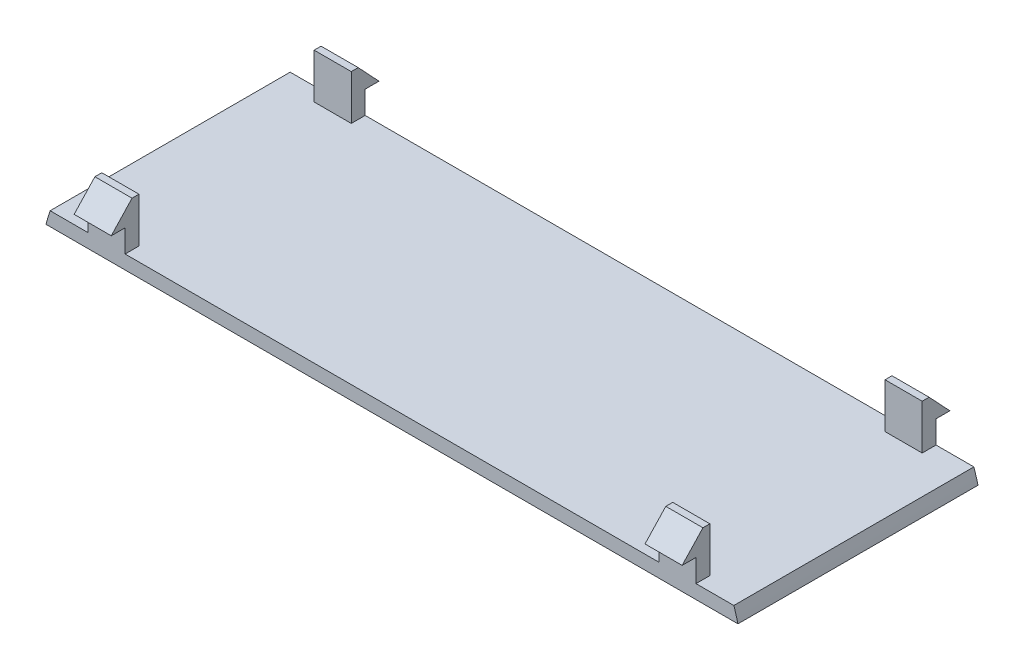
ISO-10303-21;
HEADER;
FILE_DESCRIPTION(('STEP AP214'),'2;1');
FILE_NAME('part.step','',(''),(''),'','','');
FILE_SCHEMA(('AUTOMOTIVE_DESIGN { 1 0 10303 214 1 1 1 1 }'));
ENDSEC;
DATA;
#1=APPLICATION_CONTEXT('core data for automotive mechanical design processes');
#2=APPLICATION_PROTOCOL_DEFINITION('international standard','automotive_design',2000,#1);
#3=PRODUCT_CONTEXT('',#1,'mechanical');
#4=PRODUCT('Part','Part','',(#3));
#5=PRODUCT_RELATED_PRODUCT_CATEGORY('part','',(#4));
#6=PRODUCT_DEFINITION_FORMATION('','',#4);
#7=PRODUCT_DEFINITION_CONTEXT('part definition',#1,'design');
#8=PRODUCT_DEFINITION('design','',#6,#7);
#9=PRODUCT_DEFINITION_SHAPE('','',#8);
#10=(LENGTH_UNIT() NAMED_UNIT(*) SI_UNIT(.MILLI.,.METRE.));
#11=(NAMED_UNIT(*) PLANE_ANGLE_UNIT() SI_UNIT($,.RADIAN.));
#12=(NAMED_UNIT(*) SI_UNIT($,.STERADIAN.) SOLID_ANGLE_UNIT());
#13=UNCERTAINTY_MEASURE_WITH_UNIT(LENGTH_MEASURE(1.E-05),#10,'distance_accuracy_value','');
#14=(GEOMETRIC_REPRESENTATION_CONTEXT(3) GLOBAL_UNCERTAINTY_ASSIGNED_CONTEXT((#13)) GLOBAL_UNIT_ASSIGNED_CONTEXT((#10,
#11,#12)) REPRESENTATION_CONTEXT('',''));
#15=CARTESIAN_POINT('',(0.,0.,0.));
#16=DIRECTION('',(0.,0.,1.));
#17=DIRECTION('',(1.,0.,0.));
#18=AXIS2_PLACEMENT_3D('',#15,#16,#17);
#19=CARTESIAN_POINT('',(-78.8038191019252,1.5875,27.5));
#20=DIRECTION('',(0.,-1.,0.));
#21=DIRECTION('',(0.,0.,-1.));
#22=AXIS2_PLACEMENT_3D('',#19,#20,#21);
#23=PLANE('',#22);
#24=DIRECTION('',(-1.,0.,0.));
#25=VECTOR('',#24,1.);
#26=CARTESIAN_POINT('',(-70.2133803974664,1.5875,1.587500136));
#27=LINE('',#26,#25);
#28=CARTESIAN_POINT('',(-70.2133803974664,1.5875,1.587500136));
#29=VERTEX_POINT('',#28);
#30=CARTESIAN_POINT('',(-74.4678803974664,1.5875,1.587500136));
#31=VERTEX_POINT('',#30);
#32=EDGE_CURVE('E59',#29,#31,#27,.T.);
#33=ORIENTED_EDGE('',*,*,#32,.T.);
#34=DIRECTION('',(0.,0.,-1.));
#35=VECTOR('',#34,1.);
#36=CARTESIAN_POINT('',(-74.4678803974664,1.5875,1.587500136));
#37=LINE('',#36,#35);
#38=CARTESIAN_POINT('',(-74.4678803974664,1.5875,1.36000006395465E-07));
#39=VERTEX_POINT('',#38);
#40=EDGE_CURVE('E721',#31,#39,#37,.T.);
#41=ORIENTED_EDGE('',*,*,#40,.T.);
#42=DIRECTION('',(-1.,0.,0.));
#43=VECTOR('',#42,1.);
#44=CARTESIAN_POINT('',(-78.8038191019252,1.5875,0.));
#45=LINE('',#44,#43);
#46=CARTESIAN_POINT('',(-78.8038191019252,1.5875,0.));
#47=VERTEX_POINT('',#46);
#48=EDGE_CURVE('E41',#39,#47,#45,.T.);
#49=ORIENTED_EDGE('',*,*,#48,.T.);
#50=DIRECTION('',(0.,0.,-1.));
#51=VECTOR('',#50,1.);
#52=CARTESIAN_POINT('',(-78.8038191019252,1.5875,27.5));
#53=LINE('',#52,#51);
#54=CARTESIAN_POINT('',(-78.8038191019252,1.5875,27.5));
#55=VERTEX_POINT('',#54);
#56=EDGE_CURVE('E47',#55,#47,#53,.T.);
#57=ORIENTED_EDGE('',*,*,#56,.F.);
#58=DIRECTION('',(-1.,0.,0.));
#59=VECTOR('',#58,1.);
#60=CARTESIAN_POINT('',(-78.8038191019252,1.5875,27.5));
#61=LINE('',#60,#59);
#62=CARTESIAN_POINT('',(-74.4678803974664,1.5875,27.5));
#63=VERTEX_POINT('',#62);
#64=EDGE_CURVE('E527',#63,#55,#61,.T.);
#65=ORIENTED_EDGE('',*,*,#64,.F.);
#66=DIRECTION('',(0.,0.,1.));
#67=VECTOR('',#66,1.);
#68=CARTESIAN_POINT('',(-74.4678803974664,1.5875,25.9125));
#69=LINE('',#68,#67);
#70=CARTESIAN_POINT('',(-74.4678803974664,1.5875,25.9125));
#71=VERTEX_POINT('',#70);
#72=EDGE_CURVE('E381',#71,#63,#69,.T.);
#73=ORIENTED_EDGE('',*,*,#72,.F.);
#74=DIRECTION('',(-1.,0.,0.));
#75=VECTOR('',#74,1.);
#76=CARTESIAN_POINT('',(-70.2133803974664,1.5875,25.9125));
#77=LINE('',#76,#75);
#78=CARTESIAN_POINT('',(-70.2133803974664,1.5875,25.9125));
#79=VERTEX_POINT('',#78);
#80=EDGE_CURVE('E365',#79,#71,#77,.T.);
#81=ORIENTED_EDGE('',*,*,#80,.F.);
#82=DIRECTION('',(0.,0.,1.));
#83=VECTOR('',#82,1.);
#84=CARTESIAN_POINT('',(-70.2133803974664,1.5875,25.9125));
#85=LINE('',#84,#83);
#86=CARTESIAN_POINT('',(-70.2133803974664,1.5875,27.5));
#87=VERTEX_POINT('',#86);
#88=EDGE_CURVE('E377',#79,#87,#85,.T.);
#89=ORIENTED_EDGE('',*,*,#88,.T.);
#90=CARTESIAN_POINT('',(-9.06288039746642,1.5875,27.5));
#91=VERTEX_POINT('',#90);
#92=EDGE_CURVE('E536',#91,#87,#61,.T.);
#93=ORIENTED_EDGE('',*,*,#92,.F.);
#94=DIRECTION('',(0.,0.,1.));
#95=VECTOR('',#94,1.);
#96=CARTESIAN_POINT('',(-9.06288039746642,1.5875,25.9125));
#97=LINE('',#96,#95);
#98=CARTESIAN_POINT('',(-9.06288039746642,1.5875,25.9125));
#99=VERTEX_POINT('',#98);
#100=EDGE_CURVE('E461',#99,#91,#97,.T.);
#101=ORIENTED_EDGE('',*,*,#100,.F.);
#102=DIRECTION('',(-1.,0.,0.));
#103=VECTOR('',#102,1.);
#104=CARTESIAN_POINT('',(-4.80838039746641,1.5875,25.9125));
#105=LINE('',#104,#103);
#106=CARTESIAN_POINT('',(-4.80838039746641,1.5875,25.9125));
#107=VERTEX_POINT('',#106);
#108=EDGE_CURVE('E445',#107,#99,#105,.T.);
#109=ORIENTED_EDGE('',*,*,#108,.F.);
#110=DIRECTION('',(0.,0.,1.));
#111=VECTOR('',#110,1.);
#112=CARTESIAN_POINT('',(-4.80838039746641,1.5875,25.9125));
#113=LINE('',#112,#111);
#114=CARTESIAN_POINT('',(-4.80838039746642,1.5875,27.5));
#115=VERTEX_POINT('',#114);
#116=EDGE_CURVE('E457',#107,#115,#113,.T.);
#117=ORIENTED_EDGE('',*,*,#116,.T.);
#118=CARTESIAN_POINT('',(-0.472441693007641,1.5875,27.5));
#119=VERTEX_POINT('',#118);
#120=EDGE_CURVE('E539',#119,#115,#61,.T.);
#121=ORIENTED_EDGE('',*,*,#120,.F.);
#122=DIRECTION('',(0.,0.,-1.));
#123=VECTOR('',#122,1.);
#124=CARTESIAN_POINT('',(-0.472441693007641,1.5875,27.5));
#125=LINE('',#124,#123);
#126=CARTESIAN_POINT('',(-0.472441693007641,1.5875,0.));
#127=VERTEX_POINT('',#126);
#128=EDGE_CURVE('E12',#119,#127,#125,.T.);
#129=ORIENTED_EDGE('',*,*,#128,.T.);
#130=CARTESIAN_POINT('',(-4.80838039746642,1.5875,0.));
#131=VERTEX_POINT('',#130);
#132=EDGE_CURVE('E553',#127,#131,#45,.T.);
#133=ORIENTED_EDGE('',*,*,#132,.T.);
#134=DIRECTION('',(0.,0.,-1.));
#135=VECTOR('',#134,1.);
#136=CARTESIAN_POINT('',(-4.80838039746641,1.5875,1.587500136));
#137=LINE('',#136,#135);
#138=CARTESIAN_POINT('',(-4.80838039746642,1.5875,1.587500136));
#139=VERTEX_POINT('',#138);
#140=EDGE_CURVE('E295',#139,#131,#137,.T.);
#141=ORIENTED_EDGE('',*,*,#140,.F.);
#142=DIRECTION('',(-1.,0.,0.));
#143=VECTOR('',#142,1.);
#144=CARTESIAN_POINT('',(-4.80838039746641,1.5875,1.587500136));
#145=LINE('',#144,#143);
#146=CARTESIAN_POINT('',(-9.06288039746642,1.5875,1.587500136));
#147=VERTEX_POINT('',#146);
#148=EDGE_CURVE('E284',#139,#147,#145,.T.);
#149=ORIENTED_EDGE('',*,*,#148,.T.);
#150=DIRECTION('',(0.,0.,-1.));
#151=VECTOR('',#150,1.);
#152=CARTESIAN_POINT('',(-9.06288039746642,1.5875,1.587500136));
#153=LINE('',#152,#151);
#154=CARTESIAN_POINT('',(-9.06288039746642,1.5875,1.36000006395465E-07));
#155=VERTEX_POINT('',#154);
#156=EDGE_CURVE('E286',#147,#155,#153,.T.);
#157=ORIENTED_EDGE('',*,*,#156,.T.);
#158=CARTESIAN_POINT('',(-70.2133803974664,1.5875,0.));
#159=VERTEX_POINT('',#158);
#160=EDGE_CURVE('E558',#155,#159,#45,.T.);
#161=ORIENTED_EDGE('',*,*,#160,.T.);
#162=DIRECTION('',(0.,0.,-1.));
#163=VECTOR('',#162,1.);
#164=CARTESIAN_POINT('',(-70.2133803974664,1.5875,1.587500136));
#165=LINE('',#164,#163);
#166=EDGE_CURVE('E55',#29,#159,#165,.T.);
#167=ORIENTED_EDGE('',*,*,#166,.F.);
#168=EDGE_LOOP('',(#33,#41,#49,#57,#65,#73,#81,#89,#93,#101,#109,#117,#121,#129,#133,#141,#149,
#157,#161,#167));
#169=FACE_BOUND('',#168,.T.);
#170=ADVANCED_FACE('F37',(#169),#23,.F.);
#171=CARTESIAN_POINT('',(-23.0456664164429,-5.99436532700956,27.5));
#172=DIRECTION('',(0.,0.,-1.));
#173=DIRECTION('',(-1.,0.,0.));
#174=AXIS2_PLACEMENT_3D('',#171,#172,#173);
#175=CYLINDRICAL_SURFACE('',#174,23.812500000034);
#176=CARTESIAN_POINT('',(-23.0456664164429,-5.99436532700956,0.));
#177=DIRECTION('',(0.,0.,1.));
#178=DIRECTION('',(-1.,0.,0.));
#179=AXIS2_PLACEMENT_3D('',#176,#177,#178);
#180=CIRCLE('',#179,23.812500000034);
#181=CARTESIAN_POINT('',(0.,0.,0.));
#182=VERTEX_POINT('',#181);
#183=EDGE_CURVE('E460',#182,#127,#180,.T.);
#184=ORIENTED_EDGE('',*,*,#183,.T.);
#185=ORIENTED_EDGE('',*,*,#128,.F.);
#186=CARTESIAN_POINT('',(-23.0456664164429,-5.99436532700956,27.5));
#187=DIRECTION('',(0.,0.,1.));
#188=DIRECTION('',(-1.,0.,0.));
#189=AXIS2_PLACEMENT_3D('',#186,#187,#188);
#190=CIRCLE('',#189,23.812500000034);
#191=CARTESIAN_POINT('',(0.,0.,27.5));
#192=VERTEX_POINT('',#191);
#193=EDGE_CURVE('E524',#192,#119,#190,.T.);
#194=ORIENTED_EDGE('',*,*,#193,.F.);
#195=DIRECTION('',(0.,0.,-1.));
#196=VECTOR('',#195,1.);
#197=CARTESIAN_POINT('',(0.,0.,27.5));
#198=LINE('',#197,#196);
#199=EDGE_CURVE('E547',#192,#182,#198,.T.);
#200=ORIENTED_EDGE('',*,*,#199,.T.);
#201=EDGE_LOOP('',(#184,#185,#194,#200));
#202=FACE_BOUND('',#201,.T.);
#203=ADVANCED_FACE('F39',(#202),#175,.T.);
#204=CARTESIAN_POINT('',(-56.2305943782771,-5.99436532707289,27.5));
#205=DIRECTION('',(0.,0.,-1.));
#206=DIRECTION('',(-1.,0.,0.));
#207=AXIS2_PLACEMENT_3D('',#204,#205,#206);
#208=CYLINDRICAL_SURFACE('',#207,23.8125000002559);
#209=CARTESIAN_POINT('',(-56.2305943782771,-5.99436532707289,0.));
#210=DIRECTION('',(0.,0.,1.));
#211=DIRECTION('',(-1.,0.,0.));
#212=AXIS2_PLACEMENT_3D('',#209,#210,#211);
#213=CIRCLE('',#212,23.8125000002559);
#214=CARTESIAN_POINT('',(-79.2762607949328,0.,0.));
#215=VERTEX_POINT('',#214);
#216=EDGE_CURVE('E552',#47,#215,#213,.T.);
#217=ORIENTED_EDGE('',*,*,#216,.T.);
#218=DIRECTION('',(0.,0.,-1.));
#219=VECTOR('',#218,1.);
#220=CARTESIAN_POINT('',(-79.2762607949328,0.,27.5));
#221=LINE('',#220,#219);
#222=CARTESIAN_POINT('',(-79.2762607949328,0.,27.5));
#223=VERTEX_POINT('',#222);
#224=EDGE_CURVE('E544',#223,#215,#221,.T.);
#225=ORIENTED_EDGE('',*,*,#224,.F.);
#226=CARTESIAN_POINT('',(-56.2305943782771,-5.99436532707289,27.5));
#227=DIRECTION('',(0.,0.,1.));
#228=DIRECTION('',(-1.,0.,0.));
#229=AXIS2_PLACEMENT_3D('',#226,#227,#228);
#230=CIRCLE('',#229,23.8125000002559);
#231=EDGE_CURVE('E531',#55,#223,#230,.T.);
#232=ORIENTED_EDGE('',*,*,#231,.F.);
#233=ORIENTED_EDGE('',*,*,#56,.T.);
#234=EDGE_LOOP('',(#217,#225,#232,#233));
#235=FACE_BOUND('',#234,.T.);
#236=ADVANCED_FACE('F595',(#235),#208,.T.);
#237=CARTESIAN_POINT('',(0.,0.,27.5));
#238=DIRECTION('',(0.,1.,0.));
#239=DIRECTION('',(0.,0.,1.));
#240=AXIS2_PLACEMENT_3D('',#237,#238,#239);
#241=PLANE('',#240);
#242=DIRECTION('',(1.,0.,0.));
#243=VECTOR('',#242,1.);
#244=CARTESIAN_POINT('',(0.,0.,0.));
#245=LINE('',#244,#243);
#246=EDGE_CURVE('E528',#215,#182,#245,.T.);
#247=ORIENTED_EDGE('',*,*,#246,.T.);
#248=ORIENTED_EDGE('',*,*,#199,.F.);
#249=DIRECTION('',(1.,0.,0.));
#250=VECTOR('',#249,1.);
#251=CARTESIAN_POINT('',(0.,0.,27.5));
#252=LINE('',#251,#250);
#253=EDGE_CURVE('E550',#223,#192,#252,.T.);
#254=ORIENTED_EDGE('',*,*,#253,.F.);
#255=ORIENTED_EDGE('',*,*,#224,.T.);
#256=EDGE_LOOP('',(#247,#248,#254,#255));
#257=FACE_BOUND('',#256,.T.);
#258=ADVANCED_FACE('F601',(#257),#241,.F.);
#259=CARTESIAN_POINT('',(-23.0456664164429,-5.99436532700956,27.5));
#260=DIRECTION('',(0.,0.,-1.));
#261=DIRECTION('',(-1.,0.,0.));
#262=AXIS2_PLACEMENT_3D('',#259,#260,#261);
#263=PLANE('',#262);
#264=ORIENTED_EDGE('',*,*,#193,.T.);
#265=ORIENTED_EDGE('',*,*,#120,.T.);
#266=DIRECTION('',(0.,1.,0.));
#267=VECTOR('',#266,1.);
#268=CARTESIAN_POINT('',(-4.80838039746641,1.5875,27.5));
#269=LINE('',#268,#267);
#270=CARTESIAN_POINT('',(-4.80838039746641,4.191,27.5));
#271=VERTEX_POINT('',#270);
#272=EDGE_CURVE('E464',#115,#271,#269,.T.);
#273=ORIENTED_EDGE('',*,*,#272,.T.);
#274=DIRECTION('',(-1.,0.,0.));
#275=VECTOR('',#274,1.);
#276=CARTESIAN_POINT('',(-4.80838039746641,4.191,27.5));
#277=LINE('',#276,#275);
#278=CARTESIAN_POINT('',(-9.06288039746642,4.191,27.5));
#279=VERTEX_POINT('',#278);
#280=EDGE_CURVE('E480',#271,#279,#277,.T.);
#281=ORIENTED_EDGE('',*,*,#280,.T.);
#282=DIRECTION('',(0.,1.,0.));
#283=VECTOR('',#282,1.);
#284=CARTESIAN_POINT('',(-9.06288039746642,1.5875,27.5));
#285=LINE('',#284,#283);
#286=EDGE_CURVE('E467',#91,#279,#285,.T.);
#287=ORIENTED_EDGE('',*,*,#286,.F.);
#288=ORIENTED_EDGE('',*,*,#92,.T.);
#289=DIRECTION('',(0.,1.,0.));
#290=VECTOR('',#289,1.);
#291=CARTESIAN_POINT('',(-70.2133803974664,1.5875,27.5));
#292=LINE('',#291,#290);
#293=CARTESIAN_POINT('',(-70.2133803974664,4.191,27.5));
#294=VERTEX_POINT('',#293);
#295=EDGE_CURVE('E384',#87,#294,#292,.T.);
#296=ORIENTED_EDGE('',*,*,#295,.T.);
#297=DIRECTION('',(-1.,0.,0.));
#298=VECTOR('',#297,1.);
#299=CARTESIAN_POINT('',(-70.2133803974664,4.191,27.5));
#300=LINE('',#299,#298);
#301=CARTESIAN_POINT('',(-74.4678803974664,4.191,27.5));
#302=VERTEX_POINT('',#301);
#303=EDGE_CURVE('E401',#294,#302,#300,.T.);
#304=ORIENTED_EDGE('',*,*,#303,.T.);
#305=DIRECTION('',(0.,1.,0.));
#306=VECTOR('',#305,1.);
#307=CARTESIAN_POINT('',(-74.4678803974664,1.5875,27.5));
#308=LINE('',#307,#306);
#309=EDGE_CURVE('E387',#63,#302,#308,.T.);
#310=ORIENTED_EDGE('',*,*,#309,.F.);
#311=ORIENTED_EDGE('',*,*,#64,.T.);
#312=ORIENTED_EDGE('',*,*,#231,.T.);
#313=ORIENTED_EDGE('',*,*,#253,.T.);
#314=EDGE_LOOP('',(#264,#265,#273,#281,#287,#288,#296,#304,#310,#311,#312,#313));
#315=FACE_BOUND('',#314,.T.);
#316=ADVANCED_FACE('F566',(#315),#263,.F.);
#317=CARTESIAN_POINT('',(-23.0456664164429,-5.99436532700956,0.));
#318=DIRECTION('',(0.,0.,-1.));
#319=DIRECTION('',(-1.,0.,0.));
#320=AXIS2_PLACEMENT_3D('',#317,#318,#319);
#321=PLANE('',#320);
#322=ORIENTED_EDGE('',*,*,#183,.F.);
#323=ORIENTED_EDGE('',*,*,#246,.F.);
#324=ORIENTED_EDGE('',*,*,#216,.F.);
#325=ORIENTED_EDGE('',*,*,#48,.F.);
#326=DIRECTION('',(0.,1.,0.));
#327=VECTOR('',#326,1.);
#328=CARTESIAN_POINT('',(-74.4678803974664,1.5875,1.36000006395465E-07));
#329=LINE('',#328,#327);
#330=CARTESIAN_POINT('',(-74.4678803974664,4.191,1.36000006395465E-07));
#331=VERTEX_POINT('',#330);
#332=EDGE_CURVE('E732',#39,#331,#329,.T.);
#333=ORIENTED_EDGE('',*,*,#332,.T.);
#334=DIRECTION('',(-1.,0.,0.));
#335=VECTOR('',#334,1.);
#336=CARTESIAN_POINT('',(-70.2133803974664,4.191,1.36000006395465E-07));
#337=LINE('',#336,#335);
#338=CARTESIAN_POINT('',(-70.2133803974664,4.191,1.36000006395465E-07));
#339=VERTEX_POINT('',#338);
#340=EDGE_CURVE('E276',#339,#331,#337,.T.);
#341=ORIENTED_EDGE('',*,*,#340,.F.);
#342=DIRECTION('',(0.,1.,0.));
#343=VECTOR('',#342,1.);
#344=CARTESIAN_POINT('',(-70.2133803974664,1.5875,1.36000006395465E-07));
#345=LINE('',#344,#343);
#346=EDGE_CURVE('E281',#159,#339,#345,.T.);
#347=ORIENTED_EDGE('',*,*,#346,.F.);
#348=ORIENTED_EDGE('',*,*,#160,.F.);
#349=DIRECTION('',(0.,1.,0.));
#350=VECTOR('',#349,1.);
#351=CARTESIAN_POINT('',(-9.06288039746642,1.5875,1.36000006395465E-07));
#352=LINE('',#351,#350);
#353=CARTESIAN_POINT('',(-9.06288039746642,4.191,1.36000006395465E-07));
#354=VERTEX_POINT('',#353);
#355=EDGE_CURVE('E305',#155,#354,#352,.T.);
#356=ORIENTED_EDGE('',*,*,#355,.T.);
#357=DIRECTION('',(-1.,0.,0.));
#358=VECTOR('',#357,1.);
#359=CARTESIAN_POINT('',(-4.80838039746641,4.191,1.36000006395465E-07));
#360=LINE('',#359,#358);
#361=CARTESIAN_POINT('',(-4.80838039746641,4.191,1.36000006395465E-07));
#362=VERTEX_POINT('',#361);
#363=EDGE_CURVE('E304',#362,#354,#360,.T.);
#364=ORIENTED_EDGE('',*,*,#363,.F.);
#365=DIRECTION('',(0.,1.,0.));
#366=VECTOR('',#365,1.);
#367=CARTESIAN_POINT('',(-4.80838039746641,1.5875,1.36000006395465E-07));
#368=LINE('',#367,#366);
#369=EDGE_CURVE('E301',#131,#362,#368,.T.);
#370=ORIENTED_EDGE('',*,*,#369,.F.);
#371=ORIENTED_EDGE('',*,*,#132,.F.);
#372=EDGE_LOOP('',(#322,#323,#324,#325,#333,#341,#347,#348,#356,#364,#370,#371));
#373=FACE_BOUND('',#372,.T.);
#374=ADVANCED_FACE('F634',(#373),#321,.T.);
#375=CARTESIAN_POINT('',(-9.06288039746641,0.,0.));
#376=DIRECTION('',(-1.,0.,0.));
#377=DIRECTION('',(0.,0.,1.));
#378=AXIS2_PLACEMENT_3D('',#375,#376,#377);
#379=PLANE('',#378);
#380=DIRECTION('',(0.,-1.,0.));
#381=VECTOR('',#380,1.);
#382=CARTESIAN_POINT('',(-9.06288039746642,6.731,25.9125));
#383=LINE('',#382,#381);
#384=CARTESIAN_POINT('',(-9.06288039746642,6.731,25.9125));
#385=VERTEX_POINT('',#384);
#386=EDGE_CURVE('E380',#385,#99,#383,.T.);
#387=ORIENTED_EDGE('',*,*,#386,.T.);
#388=ORIENTED_EDGE('',*,*,#100,.T.);
#389=ORIENTED_EDGE('',*,*,#286,.T.);
#390=DIRECTION('',(0.,0.,1.));
#391=VECTOR('',#390,1.);
#392=CARTESIAN_POINT('',(-9.06288039746642,4.191,27.5));
#393=LINE('',#392,#391);
#394=CARTESIAN_POINT('',(-9.06288039746642,4.191,29.0875));
#395=VERTEX_POINT('',#394);
#396=EDGE_CURVE('E483',#279,#395,#393,.T.);
#397=ORIENTED_EDGE('',*,*,#396,.T.);
#398=DIRECTION('',(0.,0.729537204140085,-0.68394112888133));
#399=VECTOR('',#398,1.);
#400=CARTESIAN_POINT('',(-9.06288039746642,4.191,29.0875));
#401=LINE('',#400,#399);
#402=CARTESIAN_POINT('',(-9.06288039746642,6.731,26.70625));
#403=VERTEX_POINT('',#402);
#404=EDGE_CURVE('E497',#395,#403,#401,.T.);
#405=ORIENTED_EDGE('',*,*,#404,.T.);
#406=DIRECTION('',(0.,0.,-1.));
#407=VECTOR('',#406,1.);
#408=CARTESIAN_POINT('',(-9.06288039746642,6.731,26.70625));
#409=LINE('',#408,#407);
#410=EDGE_CURVE('E448',#403,#385,#409,.T.);
#411=ORIENTED_EDGE('',*,*,#410,.T.);
#412=EDGE_LOOP('',(#387,#388,#389,#397,#405,#411));
#413=FACE_BOUND('',#412,.T.);
#414=ADVANCED_FACE('F616',(#413),#379,.T.);
#415=CARTESIAN_POINT('',(-4.80838039746641,0.,0.));
#416=DIRECTION('',(-1.,0.,0.));
#417=DIRECTION('',(0.,0.,1.));
#418=AXIS2_PLACEMENT_3D('',#415,#416,#417);
#419=PLANE('',#418);
#420=DIRECTION('',(0.,-1.,0.));
#421=VECTOR('',#420,1.);
#422=CARTESIAN_POINT('',(-4.80838039746641,6.731,25.9125));
#423=LINE('',#422,#421);
#424=CARTESIAN_POINT('',(-4.80838039746641,6.731,25.9125));
#425=VERTEX_POINT('',#424);
#426=EDGE_CURVE('E449',#425,#107,#423,.T.);
#427=ORIENTED_EDGE('',*,*,#426,.F.);
#428=DIRECTION('',(0.,0.,-1.));
#429=VECTOR('',#428,1.);
#430=CARTESIAN_POINT('',(-4.80838039746641,6.731,26.70625));
#431=LINE('',#430,#429);
#432=CARTESIAN_POINT('',(-4.80838039746641,6.731,26.70625));
#433=VERTEX_POINT('',#432);
#434=EDGE_CURVE('E505',#433,#425,#431,.T.);
#435=ORIENTED_EDGE('',*,*,#434,.F.);
#436=DIRECTION('',(0.,0.729537204140085,-0.68394112888133));
#437=VECTOR('',#436,1.);
#438=CARTESIAN_POINT('',(-4.80838039746641,4.191,29.0875));
#439=LINE('',#438,#437);
#440=CARTESIAN_POINT('',(-4.80838039746641,4.191,29.0875));
#441=VERTEX_POINT('',#440);
#442=EDGE_CURVE('E491',#441,#433,#439,.T.);
#443=ORIENTED_EDGE('',*,*,#442,.F.);
#444=DIRECTION('',(0.,0.,1.));
#445=VECTOR('',#444,1.);
#446=CARTESIAN_POINT('',(-4.80838039746641,4.191,27.5));
#447=LINE('',#446,#445);
#448=EDGE_CURVE('E477',#271,#441,#447,.T.);
#449=ORIENTED_EDGE('',*,*,#448,.F.);
#450=ORIENTED_EDGE('',*,*,#272,.F.);
#451=ORIENTED_EDGE('',*,*,#116,.F.);
#452=EDGE_LOOP('',(#427,#435,#443,#449,#450,#451));
#453=FACE_BOUND('',#452,.T.);
#454=ADVANCED_FACE('F610',(#453),#419,.F.);
#455=CARTESIAN_POINT('',(-4.80838039746641,6.731,25.9125));
#456=DIRECTION('',(0.,0.,-1.));
#457=DIRECTION('',(-1.,0.,0.));
#458=AXIS2_PLACEMENT_3D('',#455,#456,#457);
#459=PLANE('',#458);
#460=ORIENTED_EDGE('',*,*,#386,.F.);
#461=DIRECTION('',(-1.,0.,0.));
#462=VECTOR('',#461,1.);
#463=CARTESIAN_POINT('',(-4.80838039746641,6.731,25.9125));
#464=LINE('',#463,#462);
#465=EDGE_CURVE('E454',#425,#385,#464,.T.);
#466=ORIENTED_EDGE('',*,*,#465,.F.);
#467=ORIENTED_EDGE('',*,*,#426,.T.);
#468=ORIENTED_EDGE('',*,*,#108,.T.);
#469=EDGE_LOOP('',(#460,#466,#467,#468));
#470=FACE_BOUND('',#469,.T.);
#471=ADVANCED_FACE('F621',(#470),#459,.T.);
#472=CARTESIAN_POINT('',(-4.80838039746641,6.731,26.70625));
#473=DIRECTION('',(0.,1.,0.));
#474=DIRECTION('',(-1.,0.,0.));
#475=AXIS2_PLACEMENT_3D('',#472,#473,#474);
#476=PLANE('',#475);
#477=ORIENTED_EDGE('',*,*,#410,.F.);
#478=DIRECTION('',(-1.,0.,0.));
#479=VECTOR('',#478,1.);
#480=CARTESIAN_POINT('',(-4.80838039746641,6.731,26.70625));
#481=LINE('',#480,#479);
#482=EDGE_CURVE('E508',#433,#403,#481,.T.);
#483=ORIENTED_EDGE('',*,*,#482,.F.);
#484=ORIENTED_EDGE('',*,*,#434,.T.);
#485=ORIENTED_EDGE('',*,*,#465,.T.);
#486=EDGE_LOOP('',(#477,#483,#484,#485));
#487=FACE_BOUND('',#486,.T.);
#488=ADVANCED_FACE('F624',(#487),#476,.T.);
#489=CARTESIAN_POINT('',(-4.80838039746641,4.191,29.0875));
#490=DIRECTION('',(0.,0.68394112888133,0.729537204140085));
#491=DIRECTION('',(0.,-0.729537204140085,0.68394112888133));
#492=AXIS2_PLACEMENT_3D('',#489,#490,#491);
#493=PLANE('',#492);
#494=ORIENTED_EDGE('',*,*,#404,.F.);
#495=DIRECTION('',(-1.,0.,0.));
#496=VECTOR('',#495,1.);
#497=CARTESIAN_POINT('',(-4.80838039746641,4.191,29.0875));
#498=LINE('',#497,#496);
#499=EDGE_CURVE('E494',#441,#395,#498,.T.);
#500=ORIENTED_EDGE('',*,*,#499,.F.);
#501=ORIENTED_EDGE('',*,*,#442,.T.);
#502=ORIENTED_EDGE('',*,*,#482,.T.);
#503=EDGE_LOOP('',(#494,#500,#501,#502));
#504=FACE_BOUND('',#503,.T.);
#505=ADVANCED_FACE('F626',(#504),#493,.T.);
#506=CARTESIAN_POINT('',(-4.80838039746641,4.191,27.5));
#507=DIRECTION('',(0.,-1.,0.));
#508=DIRECTION('',(1.,0.,0.));
#509=AXIS2_PLACEMENT_3D('',#506,#507,#508);
#510=PLANE('',#509);
#511=ORIENTED_EDGE('',*,*,#396,.F.);
#512=ORIENTED_EDGE('',*,*,#280,.F.);
#513=ORIENTED_EDGE('',*,*,#448,.T.);
#514=ORIENTED_EDGE('',*,*,#499,.T.);
#515=EDGE_LOOP('',(#511,#512,#513,#514));
#516=FACE_BOUND('',#515,.T.);
#517=ADVANCED_FACE('F613',(#516),#510,.T.);
#518=CARTESIAN_POINT('',(-74.4678803974668,0.,6.30082970016941E-13));
#519=DIRECTION('',(-1.,0.,0.));
#520=DIRECTION('',(0.,0.,1.));
#521=AXIS2_PLACEMENT_3D('',#518,#519,#520);
#522=PLANE('',#521);
#523=DIRECTION('',(0.,-1.,0.));
#524=VECTOR('',#523,1.);
#525=CARTESIAN_POINT('',(-74.4678803974664,6.731,25.9125));
#526=LINE('',#525,#524);
#527=CARTESIAN_POINT('',(-74.4678803974664,6.731,25.9125));
#528=VERTEX_POINT('',#527);
#529=EDGE_CURVE('E298',#528,#71,#526,.T.);
#530=ORIENTED_EDGE('',*,*,#529,.T.);
#531=ORIENTED_EDGE('',*,*,#72,.T.);
#532=ORIENTED_EDGE('',*,*,#309,.T.);
#533=DIRECTION('',(0.,0.,1.));
#534=VECTOR('',#533,1.);
#535=CARTESIAN_POINT('',(-74.4678803974664,4.191,27.5));
#536=LINE('',#535,#534);
#537=CARTESIAN_POINT('',(-74.4678803974664,4.191,29.0875));
#538=VERTEX_POINT('',#537);
#539=EDGE_CURVE('E404',#302,#538,#536,.T.);
#540=ORIENTED_EDGE('',*,*,#539,.T.);
#541=DIRECTION('',(0.,0.729537204140085,-0.68394112888133));
#542=VECTOR('',#541,1.);
#543=CARTESIAN_POINT('',(-74.4678803974664,4.191,29.0875));
#544=LINE('',#543,#542);
#545=CARTESIAN_POINT('',(-74.4678803974664,6.731,26.70625));
#546=VERTEX_POINT('',#545);
#547=EDGE_CURVE('E418',#538,#546,#544,.T.);
#548=ORIENTED_EDGE('',*,*,#547,.T.);
#549=DIRECTION('',(0.,0.,-1.));
#550=VECTOR('',#549,1.);
#551=CARTESIAN_POINT('',(-74.4678803974664,6.731,26.70625));
#552=LINE('',#551,#550);
#553=EDGE_CURVE('E368',#546,#528,#552,.T.);
#554=ORIENTED_EDGE('',*,*,#553,.T.);
#555=EDGE_LOOP('',(#530,#531,#532,#540,#548,#554));
#556=FACE_BOUND('',#555,.T.);
#557=ADVANCED_FACE('F590',(#556),#522,.T.);
#558=CARTESIAN_POINT('',(-70.2133803974668,0.,6.30082970016941E-13));
#559=DIRECTION('',(-1.,0.,0.));
#560=DIRECTION('',(0.,0.,1.));
#561=AXIS2_PLACEMENT_3D('',#558,#559,#560);
#562=PLANE('',#561);
#563=DIRECTION('',(0.,-1.,0.));
#564=VECTOR('',#563,1.);
#565=CARTESIAN_POINT('',(-70.2133803974664,6.731,25.9125));
#566=LINE('',#565,#564);
#567=CARTESIAN_POINT('',(-70.2133803974664,6.731,25.9125));
#568=VERTEX_POINT('',#567);
#569=EDGE_CURVE('E369',#568,#79,#566,.T.);
#570=ORIENTED_EDGE('',*,*,#569,.F.);
#571=DIRECTION('',(0.,0.,-1.));
#572=VECTOR('',#571,1.);
#573=CARTESIAN_POINT('',(-70.2133803974664,6.731,26.70625));
#574=LINE('',#573,#572);
#575=CARTESIAN_POINT('',(-70.2133803974664,6.731,26.70625));
#576=VERTEX_POINT('',#575);
#577=EDGE_CURVE('E426',#576,#568,#574,.T.);
#578=ORIENTED_EDGE('',*,*,#577,.F.);
#579=DIRECTION('',(0.,0.729537204140085,-0.68394112888133));
#580=VECTOR('',#579,1.);
#581=CARTESIAN_POINT('',(-70.2133803974664,4.191,29.0875));
#582=LINE('',#581,#580);
#583=CARTESIAN_POINT('',(-70.2133803974664,4.191,29.0875));
#584=VERTEX_POINT('',#583);
#585=EDGE_CURVE('E412',#584,#576,#582,.T.);
#586=ORIENTED_EDGE('',*,*,#585,.F.);
#587=DIRECTION('',(0.,0.,1.));
#588=VECTOR('',#587,1.);
#589=CARTESIAN_POINT('',(-70.2133803974664,4.191,27.5));
#590=LINE('',#589,#588);
#591=EDGE_CURVE('E398',#294,#584,#590,.T.);
#592=ORIENTED_EDGE('',*,*,#591,.F.);
#593=ORIENTED_EDGE('',*,*,#295,.F.);
#594=ORIENTED_EDGE('',*,*,#88,.F.);
#595=EDGE_LOOP('',(#570,#578,#586,#592,#593,#594));
#596=FACE_BOUND('',#595,.T.);
#597=ADVANCED_FACE('F572',(#596),#562,.F.);
#598=CARTESIAN_POINT('',(-70.2133803974664,6.731,25.9125));
#599=DIRECTION('',(0.,0.,-1.));
#600=DIRECTION('',(-1.,0.,0.));
#601=AXIS2_PLACEMENT_3D('',#598,#599,#600);
#602=PLANE('',#601);
#603=ORIENTED_EDGE('',*,*,#529,.F.);
#604=DIRECTION('',(-1.,0.,0.));
#605=VECTOR('',#604,1.);
#606=CARTESIAN_POINT('',(-70.2133803974664,6.731,25.9125));
#607=LINE('',#606,#605);
#608=EDGE_CURVE('E374',#568,#528,#607,.T.);
#609=ORIENTED_EDGE('',*,*,#608,.F.);
#610=ORIENTED_EDGE('',*,*,#569,.T.);
#611=ORIENTED_EDGE('',*,*,#80,.T.);
#612=EDGE_LOOP('',(#603,#609,#610,#611));
#613=FACE_BOUND('',#612,.T.);
#614=ADVANCED_FACE('F576',(#613),#602,.T.);
#615=CARTESIAN_POINT('',(-70.2133803974664,6.731,26.70625));
#616=DIRECTION('',(0.,1.,0.));
#617=DIRECTION('',(0.,0.,1.));
#618=AXIS2_PLACEMENT_3D('',#615,#616,#617);
#619=PLANE('',#618);
#620=ORIENTED_EDGE('',*,*,#553,.F.);
#621=DIRECTION('',(-1.,0.,0.));
#622=VECTOR('',#621,1.);
#623=CARTESIAN_POINT('',(-70.2133803974664,6.731,26.70625));
#624=LINE('',#623,#622);
#625=EDGE_CURVE('E429',#576,#546,#624,.T.);
#626=ORIENTED_EDGE('',*,*,#625,.F.);
#627=ORIENTED_EDGE('',*,*,#577,.T.);
#628=ORIENTED_EDGE('',*,*,#608,.T.);
#629=EDGE_LOOP('',(#620,#626,#627,#628));
#630=FACE_BOUND('',#629,.T.);
#631=ADVANCED_FACE('F580',(#630),#619,.T.);
#632=CARTESIAN_POINT('',(-70.2133803974664,4.191,29.0875));
#633=DIRECTION('',(0.,0.68394112888133,0.729537204140085));
#634=DIRECTION('',(0.,-0.729537204140085,0.68394112888133));
#635=AXIS2_PLACEMENT_3D('',#632,#633,#634);
#636=PLANE('',#635);
#637=ORIENTED_EDGE('',*,*,#547,.F.);
#638=DIRECTION('',(-1.,0.,0.));
#639=VECTOR('',#638,1.);
#640=CARTESIAN_POINT('',(-70.2133803974664,4.191,29.0875));
#641=LINE('',#640,#639);
#642=EDGE_CURVE('E415',#584,#538,#641,.T.);
#643=ORIENTED_EDGE('',*,*,#642,.F.);
#644=ORIENTED_EDGE('',*,*,#585,.T.);
#645=ORIENTED_EDGE('',*,*,#625,.T.);
#646=EDGE_LOOP('',(#637,#643,#644,#645));
#647=FACE_BOUND('',#646,.T.);
#648=ADVANCED_FACE('F585',(#647),#636,.T.);
#649=CARTESIAN_POINT('',(-70.2133803974664,4.191,27.5));
#650=DIRECTION('',(0.,-1.,0.));
#651=DIRECTION('',(0.,0.,-1.));
#652=AXIS2_PLACEMENT_3D('',#649,#650,#651);
#653=PLANE('',#652);
#654=ORIENTED_EDGE('',*,*,#539,.F.);
#655=ORIENTED_EDGE('',*,*,#303,.F.);
#656=ORIENTED_EDGE('',*,*,#591,.T.);
#657=ORIENTED_EDGE('',*,*,#642,.T.);
#658=EDGE_LOOP('',(#654,#655,#656,#657));
#659=FACE_BOUND('',#658,.T.);
#660=ADVANCED_FACE('F588',(#659),#653,.T.);
#661=CARTESIAN_POINT('',(-9.06288039746641,0.,0.));
#662=DIRECTION('',(-1.,0.,0.));
#663=DIRECTION('',(0.,0.,1.));
#664=AXIS2_PLACEMENT_3D('',#661,#662,#663);
#665=PLANE('',#664);
#666=ORIENTED_EDGE('',*,*,#156,.F.);
#667=DIRECTION('',(0.,-1.,0.));
#668=VECTOR('',#667,1.);
#669=CARTESIAN_POINT('',(-9.06288039746642,6.731,1.587500136));
#670=LINE('',#669,#668);
#671=CARTESIAN_POINT('',(-9.06288039746642,6.731,1.587500136));
#672=VERTEX_POINT('',#671);
#673=EDGE_CURVE('E292',#672,#147,#670,.T.);
#674=ORIENTED_EDGE('',*,*,#673,.F.);
#675=DIRECTION('',(0.,0.,1.));
#676=VECTOR('',#675,1.);
#677=CARTESIAN_POINT('',(-9.06288039746642,6.731,0.793750136000006));
#678=LINE('',#677,#676);
#679=CARTESIAN_POINT('',(-9.06288039746642,6.731,0.793750136000006));
#680=VERTEX_POINT('',#679);
#681=EDGE_CURVE('E327',#680,#672,#678,.T.);
#682=ORIENTED_EDGE('',*,*,#681,.F.);
#683=DIRECTION('',(0.,0.729537204140085,0.68394112888133));
#684=VECTOR('',#683,1.);
#685=CARTESIAN_POINT('',(-9.06288039746642,4.191,-1.58749986399999));
#686=LINE('',#685,#684);
#687=CARTESIAN_POINT('',(-9.06288039746642,4.191,-1.58749986399999));
#688=VERTEX_POINT('',#687);
#689=EDGE_CURVE('E341',#688,#680,#686,.T.);
#690=ORIENTED_EDGE('',*,*,#689,.F.);
#691=DIRECTION('',(0.,0.,-1.));
#692=VECTOR('',#691,1.);
#693=CARTESIAN_POINT('',(-9.06288039746642,4.191,1.36000006395465E-07));
#694=LINE('',#693,#692);
#695=EDGE_CURVE('E355',#354,#688,#694,.T.);
#696=ORIENTED_EDGE('',*,*,#695,.F.);
#697=ORIENTED_EDGE('',*,*,#355,.F.);
#698=EDGE_LOOP('',(#666,#674,#682,#690,#696,#697));
#699=FACE_BOUND('',#698,.T.);
#700=ADVANCED_FACE('F667',(#699),#665,.T.);
#701=CARTESIAN_POINT('',(-4.80838039746641,0.,0.));
#702=DIRECTION('',(-1.,0.,0.));
#703=DIRECTION('',(0.,0.,1.));
#704=AXIS2_PLACEMENT_3D('',#701,#702,#703);
#705=PLANE('',#704);
#706=ORIENTED_EDGE('',*,*,#140,.T.);
#707=ORIENTED_EDGE('',*,*,#369,.T.);
#708=DIRECTION('',(0.,0.,-1.));
#709=VECTOR('',#708,1.);
#710=CARTESIAN_POINT('',(-4.80838039746641,4.191,1.36000006395465E-07));
#711=LINE('',#710,#709);
#712=CARTESIAN_POINT('',(-4.80838039746641,4.191,-1.58749986399999));
#713=VERTEX_POINT('',#712);
#714=EDGE_CURVE('E350',#362,#713,#711,.T.);
#715=ORIENTED_EDGE('',*,*,#714,.T.);
#716=DIRECTION('',(0.,0.729537204140085,0.68394112888133));
#717=VECTOR('',#716,1.);
#718=CARTESIAN_POINT('',(-4.80838039746641,4.191,-1.58749986399999));
#719=LINE('',#718,#717);
#720=CARTESIAN_POINT('',(-4.80838039746641,6.731,0.793750136000006));
#721=VERTEX_POINT('',#720);
#722=EDGE_CURVE('E336',#713,#721,#719,.T.);
#723=ORIENTED_EDGE('',*,*,#722,.T.);
#724=DIRECTION('',(0.,0.,1.));
#725=VECTOR('',#724,1.);
#726=CARTESIAN_POINT('',(-4.80838039746641,6.731,0.793750136000006));
#727=LINE('',#726,#725);
#728=CARTESIAN_POINT('',(-4.80838039746641,6.731,1.587500136));
#729=VERTEX_POINT('',#728);
#730=EDGE_CURVE('E322',#721,#729,#727,.T.);
#731=ORIENTED_EDGE('',*,*,#730,.T.);
#732=DIRECTION('',(0.,-1.,0.));
#733=VECTOR('',#732,1.);
#734=CARTESIAN_POINT('',(-4.80838039746641,6.731,1.587500136));
#735=LINE('',#734,#733);
#736=EDGE_CURVE('E287',#729,#139,#735,.T.);
#737=ORIENTED_EDGE('',*,*,#736,.T.);
#738=EDGE_LOOP('',(#706,#707,#715,#723,#731,#737));
#739=FACE_BOUND('',#738,.T.);
#740=ADVANCED_FACE('F676',(#739),#705,.F.);
#741=CARTESIAN_POINT('',(-4.80838039746641,4.191,1.36000006395465E-07));
#742=DIRECTION('',(0.,1.,0.));
#743=DIRECTION('',(0.,0.,1.));
#744=AXIS2_PLACEMENT_3D('',#741,#742,#743);
#745=PLANE('',#744);
#746=ORIENTED_EDGE('',*,*,#695,.T.);
#747=DIRECTION('',(-1.,0.,0.));
#748=VECTOR('',#747,1.);
#749=CARTESIAN_POINT('',(-4.80838039746641,4.191,-1.58749986399999));
#750=LINE('',#749,#748);
#751=EDGE_CURVE('E345',#713,#688,#750,.T.);
#752=ORIENTED_EDGE('',*,*,#751,.F.);
#753=ORIENTED_EDGE('',*,*,#714,.F.);
#754=ORIENTED_EDGE('',*,*,#363,.T.);
#755=EDGE_LOOP('',(#746,#752,#753,#754));
#756=FACE_BOUND('',#755,.T.);
#757=ADVANCED_FACE('F680',(#756),#745,.F.);
#758=CARTESIAN_POINT('',(-4.80838039746641,4.191,-1.58749986399999));
#759=DIRECTION('',(0.,-0.68394112888133,0.729537204140085));
#760=DIRECTION('',(0.,-0.729537204140085,-0.68394112888133));
#761=AXIS2_PLACEMENT_3D('',#758,#759,#760);
#762=PLANE('',#761);
#763=ORIENTED_EDGE('',*,*,#689,.T.);
#764=DIRECTION('',(-1.,0.,0.));
#765=VECTOR('',#764,1.);
#766=CARTESIAN_POINT('',(-4.80838039746641,6.731,0.793750136000006));
#767=LINE('',#766,#765);
#768=EDGE_CURVE('E331',#721,#680,#767,.T.);
#769=ORIENTED_EDGE('',*,*,#768,.F.);
#770=ORIENTED_EDGE('',*,*,#722,.F.);
#771=ORIENTED_EDGE('',*,*,#751,.T.);
#772=EDGE_LOOP('',(#763,#769,#770,#771));
#773=FACE_BOUND('',#772,.T.);
#774=ADVANCED_FACE('F689',(#773),#762,.F.);
#775=CARTESIAN_POINT('',(-4.80838039746641,6.731,0.793750136000006));
#776=DIRECTION('',(0.,-1.,0.));
#777=DIRECTION('',(0.,0.,-1.));
#778=AXIS2_PLACEMENT_3D('',#775,#776,#777);
#779=PLANE('',#778);
#780=ORIENTED_EDGE('',*,*,#681,.T.);
#781=DIRECTION('',(-1.,0.,0.));
#782=VECTOR('',#781,1.);
#783=CARTESIAN_POINT('',(-4.80838039746641,6.731,1.587500136));
#784=LINE('',#783,#782);
#785=EDGE_CURVE('E310',#729,#672,#784,.T.);
#786=ORIENTED_EDGE('',*,*,#785,.F.);
#787=ORIENTED_EDGE('',*,*,#730,.F.);
#788=ORIENTED_EDGE('',*,*,#768,.T.);
#789=EDGE_LOOP('',(#780,#786,#787,#788));
#790=FACE_BOUND('',#789,.T.);
#791=ADVANCED_FACE('F685',(#790),#779,.F.);
#792=CARTESIAN_POINT('',(-4.80838039746641,6.731,1.587500136));
#793=DIRECTION('',(0.,0.,-1.));
#794=DIRECTION('',(-1.,0.,0.));
#795=AXIS2_PLACEMENT_3D('',#792,#793,#794);
#796=PLANE('',#795);
#797=ORIENTED_EDGE('',*,*,#673,.T.);
#798=ORIENTED_EDGE('',*,*,#148,.F.);
#799=ORIENTED_EDGE('',*,*,#736,.F.);
#800=ORIENTED_EDGE('',*,*,#785,.T.);
#801=EDGE_LOOP('',(#797,#798,#799,#800));
#802=FACE_BOUND('',#801,.T.);
#803=ADVANCED_FACE('F662',(#802),#796,.F.);
#804=CARTESIAN_POINT('',(-74.4678803974666,0.,-6.26457292805363E-13));
#805=DIRECTION('',(-1.,0.,0.));
#806=DIRECTION('',(0.,0.,1.));
#807=AXIS2_PLACEMENT_3D('',#804,#805,#806);
#808=PLANE('',#807);
#809=ORIENTED_EDGE('',*,*,#40,.F.);
#810=DIRECTION('',(0.,-1.,0.));
#811=VECTOR('',#810,1.);
#812=CARTESIAN_POINT('',(-74.4678803974664,6.731,1.587500136));
#813=LINE('',#812,#811);
#814=CARTESIAN_POINT('',(-74.4678803974664,6.731,1.587500136));
#815=VERTEX_POINT('',#814);
#816=EDGE_CURVE('E231',#815,#31,#813,.T.);
#817=ORIENTED_EDGE('',*,*,#816,.F.);
#818=DIRECTION('',(0.,0.,1.));
#819=VECTOR('',#818,1.);
#820=CARTESIAN_POINT('',(-74.4678803974664,6.731,0.793750136000006));
#821=LINE('',#820,#819);
#822=CARTESIAN_POINT('',(-74.4678803974664,6.731,0.793750136000006));
#823=VERTEX_POINT('',#822);
#824=EDGE_CURVE('E239',#823,#815,#821,.T.);
#825=ORIENTED_EDGE('',*,*,#824,.F.);
#826=DIRECTION('',(0.,0.729537204140085,0.68394112888133));
#827=VECTOR('',#826,1.);
#828=CARTESIAN_POINT('',(-74.4678803974664,4.191,-1.58749986399999));
#829=LINE('',#828,#827);
#830=CARTESIAN_POINT('',(-74.4678803974664,4.191,-1.58749986399999));
#831=VERTEX_POINT('',#830);
#832=EDGE_CURVE('E259',#831,#823,#829,.T.);
#833=ORIENTED_EDGE('',*,*,#832,.F.);
#834=DIRECTION('',(0.,0.,-1.));
#835=VECTOR('',#834,1.);
#836=CARTESIAN_POINT('',(-74.4678803974664,4.191,1.36000006395465E-07));
#837=LINE('',#836,#835);
#838=EDGE_CURVE('E272',#331,#831,#837,.T.);
#839=ORIENTED_EDGE('',*,*,#838,.F.);
#840=ORIENTED_EDGE('',*,*,#332,.F.);
#841=EDGE_LOOP('',(#809,#817,#825,#833,#839,#840));
#842=FACE_BOUND('',#841,.T.);
#843=ADVANCED_FACE('F684',(#842),#808,.T.);
#844=CARTESIAN_POINT('',(-70.2133803974666,0.,-6.26457292805363E-13));
#845=DIRECTION('',(-1.,0.,0.));
#846=DIRECTION('',(0.,0.,1.));
#847=AXIS2_PLACEMENT_3D('',#844,#845,#846);
#848=PLANE('',#847);
#849=ORIENTED_EDGE('',*,*,#166,.T.);
#850=ORIENTED_EDGE('',*,*,#346,.T.);
#851=DIRECTION('',(0.,0.,-1.));
#852=VECTOR('',#851,1.);
#853=CARTESIAN_POINT('',(-70.2133803974664,4.191,1.36000006395465E-07));
#854=LINE('',#853,#852);
#855=CARTESIAN_POINT('',(-70.2133803974664,4.191,-1.58749986399999));
#856=VERTEX_POINT('',#855);
#857=EDGE_CURVE('E268',#339,#856,#854,.T.);
#858=ORIENTED_EDGE('',*,*,#857,.T.);
#859=DIRECTION('',(0.,0.729537204140085,0.68394112888133));
#860=VECTOR('',#859,1.);
#861=CARTESIAN_POINT('',(-70.2133803974664,4.191,-1.58749986399999));
#862=LINE('',#861,#860);
#863=CARTESIAN_POINT('',(-70.2133803974664,6.731,0.793750136000006));
#864=VERTEX_POINT('',#863);
#865=EDGE_CURVE('E244',#856,#864,#862,.T.);
#866=ORIENTED_EDGE('',*,*,#865,.T.);
#867=DIRECTION('',(0.,0.,1.));
#868=VECTOR('',#867,1.);
#869=CARTESIAN_POINT('',(-70.2133803974664,6.731,0.793750136000006));
#870=LINE('',#869,#868);
#871=CARTESIAN_POINT('',(-70.2133803974664,6.731,1.587500136));
#872=VERTEX_POINT('',#871);
#873=EDGE_CURVE('E236',#864,#872,#870,.T.);
#874=ORIENTED_EDGE('',*,*,#873,.T.);
#875=DIRECTION('',(0.,-1.,0.));
#876=VECTOR('',#875,1.);
#877=CARTESIAN_POINT('',(-70.2133803974664,6.731,1.587500136));
#878=LINE('',#877,#876);
#879=EDGE_CURVE('E224',#872,#29,#878,.T.);
#880=ORIENTED_EDGE('',*,*,#879,.T.);
#881=EDGE_LOOP('',(#849,#850,#858,#866,#874,#880));
#882=FACE_BOUND('',#881,.T.);
#883=ADVANCED_FACE('F242',(#882),#848,.F.);
#884=CARTESIAN_POINT('',(-70.2133803974664,4.191,1.36000006395465E-07));
#885=DIRECTION('',(0.,1.,0.));
#886=DIRECTION('',(0.,0.,1.));
#887=AXIS2_PLACEMENT_3D('',#884,#885,#886);
#888=PLANE('',#887);
#889=ORIENTED_EDGE('',*,*,#838,.T.);
#890=DIRECTION('',(-1.,0.,0.));
#891=VECTOR('',#890,1.);
#892=CARTESIAN_POINT('',(-70.2133803974664,4.191,-1.58749986399999));
#893=LINE('',#892,#891);
#894=EDGE_CURVE('E263',#856,#831,#893,.T.);
#895=ORIENTED_EDGE('',*,*,#894,.F.);
#896=ORIENTED_EDGE('',*,*,#857,.F.);
#897=ORIENTED_EDGE('',*,*,#340,.T.);
#898=EDGE_LOOP('',(#889,#895,#896,#897));
#899=FACE_BOUND('',#898,.T.);
#900=ADVANCED_FACE('F702',(#899),#888,.F.);
#901=CARTESIAN_POINT('',(-70.2133803974664,4.191,-1.58749986399999));
#902=DIRECTION('',(0.,-0.68394112888133,0.729537204140085));
#903=DIRECTION('',(0.,-0.729537204140085,-0.68394112888133));
#904=AXIS2_PLACEMENT_3D('',#901,#902,#903);
#905=PLANE('',#904);
#906=ORIENTED_EDGE('',*,*,#832,.T.);
#907=DIRECTION('',(-1.,0.,0.));
#908=VECTOR('',#907,1.);
#909=CARTESIAN_POINT('',(-70.2133803974664,6.731,0.793750136000006));
#910=LINE('',#909,#908);
#911=EDGE_CURVE('E246',#864,#823,#910,.T.);
#912=ORIENTED_EDGE('',*,*,#911,.F.);
#913=ORIENTED_EDGE('',*,*,#865,.F.);
#914=ORIENTED_EDGE('',*,*,#894,.T.);
#915=EDGE_LOOP('',(#906,#912,#913,#914));
#916=FACE_BOUND('',#915,.T.);
#917=ADVANCED_FACE('F707',(#916),#905,.F.);
#918=CARTESIAN_POINT('',(-70.2133803974664,6.731,0.793750136000006));
#919=DIRECTION('',(0.,-1.,0.));
#920=DIRECTION('',(0.,0.,-1.));
#921=AXIS2_PLACEMENT_3D('',#918,#919,#920);
#922=PLANE('',#921);
#923=ORIENTED_EDGE('',*,*,#824,.T.);
#924=DIRECTION('',(-1.,0.,0.));
#925=VECTOR('',#924,1.);
#926=CARTESIAN_POINT('',(-70.2133803974664,6.731,1.587500136));
#927=LINE('',#926,#925);
#928=EDGE_CURVE('E227',#872,#815,#927,.T.);
#929=ORIENTED_EDGE('',*,*,#928,.F.);
#930=ORIENTED_EDGE('',*,*,#873,.F.);
#931=ORIENTED_EDGE('',*,*,#911,.T.);
#932=EDGE_LOOP('',(#923,#929,#930,#931));
#933=FACE_BOUND('',#932,.T.);
#934=ADVANCED_FACE('F234',(#933),#922,.F.);
#935=CARTESIAN_POINT('',(-70.2133803974664,6.731,1.587500136));
#936=DIRECTION('',(0.,0.,-1.));
#937=DIRECTION('',(-1.,0.,0.));
#938=AXIS2_PLACEMENT_3D('',#935,#936,#937);
#939=PLANE('',#938);
#940=ORIENTED_EDGE('',*,*,#816,.T.);
#941=ORIENTED_EDGE('',*,*,#32,.F.);
#942=ORIENTED_EDGE('',*,*,#879,.F.);
#943=ORIENTED_EDGE('',*,*,#928,.T.);
#944=EDGE_LOOP('',(#940,#941,#942,#943));
#945=FACE_BOUND('',#944,.T.);
#946=ADVANCED_FACE('F226',(#945),#939,.F.);
#947=CLOSED_SHELL('',(#170,#203,#236,#258,#316,#374,#414,#454,#471,#488,#505,#517,#557,#597,
#614,#631,#648,#660,#700,#740,#757,#774,#791,#803,#843,#883,#900,#917,#934,#946));
#948=MANIFOLD_SOLID_BREP('B2',#947);
#949=ADVANCED_BREP_SHAPE_REPRESENTATION('',(#18,#948),#14);
#950=SHAPE_DEFINITION_REPRESENTATION(#9,#949);
ENDSEC;
END-ISO-10303-21;
